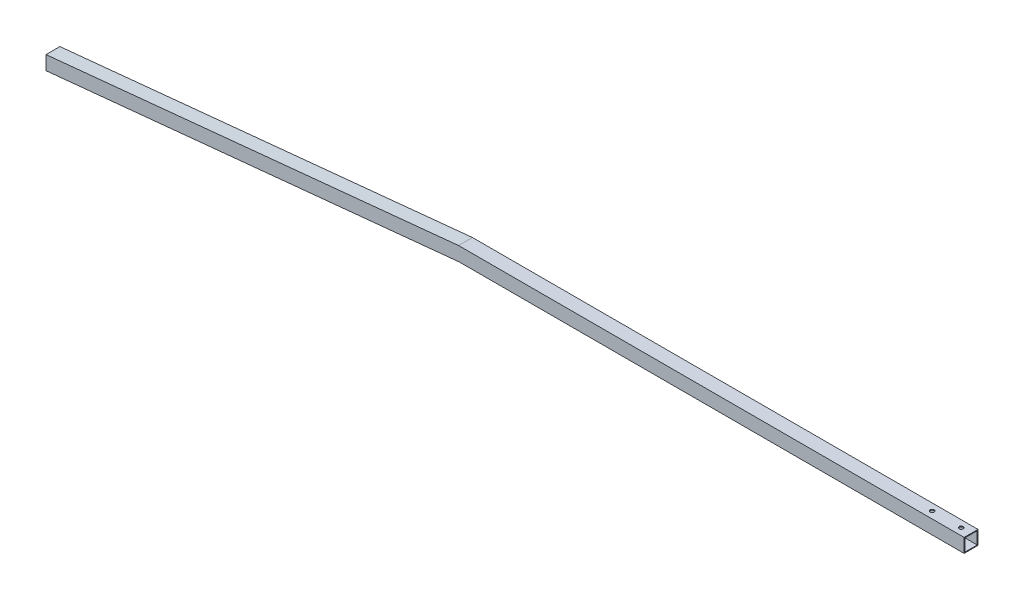
ISO-10303-21;
HEADER;
FILE_DESCRIPTION(('STEP AP214'),'2;1');
FILE_NAME('part.step','',(''),(''),'','','');
FILE_SCHEMA(('AUTOMOTIVE_DESIGN { 1 0 10303 214 1 1 1 1 }'));
ENDSEC;
DATA;
#1=APPLICATION_CONTEXT('core data for automotive mechanical design processes');
#2=APPLICATION_PROTOCOL_DEFINITION('international standard','automotive_design',2000,#1);
#3=PRODUCT_CONTEXT('',#1,'mechanical');
#4=PRODUCT('Part','Part','',(#3));
#5=PRODUCT_RELATED_PRODUCT_CATEGORY('part','',(#4));
#6=PRODUCT_DEFINITION_FORMATION('','',#4);
#7=PRODUCT_DEFINITION_CONTEXT('part definition',#1,'design');
#8=PRODUCT_DEFINITION('design','',#6,#7);
#9=PRODUCT_DEFINITION_SHAPE('','',#8);
#10=(LENGTH_UNIT() NAMED_UNIT(*) SI_UNIT(.MILLI.,.METRE.));
#11=(NAMED_UNIT(*) PLANE_ANGLE_UNIT() SI_UNIT($,.RADIAN.));
#12=(NAMED_UNIT(*) SI_UNIT($,.STERADIAN.) SOLID_ANGLE_UNIT());
#13=UNCERTAINTY_MEASURE_WITH_UNIT(LENGTH_MEASURE(1.E-05),#10,'distance_accuracy_value','');
#14=(GEOMETRIC_REPRESENTATION_CONTEXT(3) GLOBAL_UNCERTAINTY_ASSIGNED_CONTEXT((#13)) GLOBAL_UNIT_ASSIGNED_CONTEXT((#10,
#11,#12)) REPRESENTATION_CONTEXT('',''));
#15=CARTESIAN_POINT('',(0.,0.,0.));
#16=DIRECTION('',(0.,0.,1.));
#17=DIRECTION('',(1.,0.,0.));
#18=AXIS2_PLACEMENT_3D('',#15,#16,#17);
#19=CARTESIAN_POINT('',(848.88,84.1375,-28.575));
#20=DIRECTION('',(0.,-1.,0.));
#21=DIRECTION('',(0.,0.,-1.));
#22=AXIS2_PLACEMENT_3D('',#19,#20,#21);
#23=PLANE('',#22);
#24=CARTESIAN_POINT('',(1809.115,84.1375,-14.2875));
#25=DIRECTION('',(0.,-1.,0.));
#26=DIRECTION('',(-1.,0.,0.));
#27=AXIS2_PLACEMENT_3D('',#24,#25,#26);
#28=CIRCLE('',#27,4.19100000000006);
#29=CARTESIAN_POINT('',(1804.924,84.1375,-14.2875));
#30=VERTEX_POINT('',#29);
#31=EDGE_CURVE('E211',#30,#30,#28,.T.);
#32=ORIENTED_EDGE('',*,*,#31,.T.);
#33=EDGE_LOOP('',(#32));
#34=FACE_BOUND('',#33,.T.);
#35=DIRECTION('',(1.,0.,0.));
#36=VECTOR('',#35,1.);
#37=CARTESIAN_POINT('',(848.88,84.1375,0.));
#38=LINE('',#37,#36);
#39=CARTESIAN_POINT('',(848.88,84.1375,0.));
#40=VERTEX_POINT('',#39);
#41=CARTESIAN_POINT('',(1889.125,84.1375,0.));
#42=VERTEX_POINT('',#41);
#43=EDGE_CURVE('E181',#40,#42,#38,.T.);
#44=ORIENTED_EDGE('',*,*,#43,.T.);
#45=DIRECTION('',(0.,0.,1.));
#46=VECTOR('',#45,1.);
#47=CARTESIAN_POINT('',(1889.125,84.1375,-28.575));
#48=LINE('',#47,#46);
#49=CARTESIAN_POINT('',(1889.125,84.1375,-28.575));
#50=VERTEX_POINT('',#49);
#51=EDGE_CURVE('E204',#50,#42,#48,.T.);
#52=ORIENTED_EDGE('',*,*,#51,.F.);
#53=DIRECTION('',(1.,0.,0.));
#54=VECTOR('',#53,1.);
#55=CARTESIAN_POINT('',(848.88,84.1375,-28.575));
#56=LINE('',#55,#54);
#57=CARTESIAN_POINT('',(848.88,84.1375,-28.575));
#58=VERTEX_POINT('',#57);
#59=EDGE_CURVE('E165',#58,#50,#56,.T.);
#60=ORIENTED_EDGE('',*,*,#59,.F.);
#61=DIRECTION('',(0.,0.,1.));
#62=VECTOR('',#61,1.);
#63=CARTESIAN_POINT('',(848.88,84.1375,-28.575));
#64=LINE('',#63,#62);
#65=EDGE_CURVE('E24',#58,#40,#64,.T.);
#66=ORIENTED_EDGE('',*,*,#65,.T.);
#67=EDGE_LOOP('',(#44,#52,#60,#66));
#68=FACE_BOUND('',#67,.T.);
#69=CARTESIAN_POINT('',(1868.805,84.1375,-14.2875));
#70=DIRECTION('',(0.,-1.,0.));
#71=DIRECTION('',(-1.,0.,0.));
#72=AXIS2_PLACEMENT_3D('',#69,#70,#71);
#73=CIRCLE('',#72,4.19100000000006);
#74=CARTESIAN_POINT('',(1864.614,84.1375,-14.2875));
#75=VERTEX_POINT('',#74);
#76=EDGE_CURVE('E311',#75,#75,#73,.T.);
#77=ORIENTED_EDGE('',*,*,#76,.T.);
#78=EDGE_LOOP('',(#77));
#79=FACE_BOUND('',#78,.T.);
#80=ADVANCED_FACE('F15',(#34,#68,#79),#23,.F.);
#81=CARTESIAN_POINT('',(850.293718292771,55.5625,-28.575));
#82=DIRECTION('',(0.,1.,0.));
#83=DIRECTION('',(-1.,0.,0.));
#84=AXIS2_PLACEMENT_3D('',#81,#82,#83);
#85=PLANE('',#84);
#86=CARTESIAN_POINT('',(1809.115,55.5625,-14.2875));
#87=DIRECTION('',(0.,1.,0.));
#88=DIRECTION('',(-1.,0.,0.));
#89=AXIS2_PLACEMENT_3D('',#86,#87,#88);
#90=CIRCLE('',#89,4.19100000000006);
#91=CARTESIAN_POINT('',(1804.924,55.5625,-14.2875));
#92=VERTEX_POINT('',#91);
#93=EDGE_CURVE('E158',#92,#92,#90,.F.);
#94=ORIENTED_EDGE('',*,*,#93,.F.);
#95=EDGE_LOOP('',(#94));
#96=FACE_BOUND('',#95,.T.);
#97=DIRECTION('',(-1.,0.,0.));
#98=VECTOR('',#97,1.);
#99=CARTESIAN_POINT('',(850.293718292771,55.5625,0.));
#100=LINE('',#99,#98);
#101=CARTESIAN_POINT('',(1889.125,55.5625,0.));
#102=VERTEX_POINT('',#101);
#103=CARTESIAN_POINT('',(850.293718292771,55.5625,0.));
#104=VERTEX_POINT('',#103);
#105=EDGE_CURVE('E187',#102,#104,#100,.T.);
#106=ORIENTED_EDGE('',*,*,#105,.T.);
#107=DIRECTION('',(0.,0.,1.));
#108=VECTOR('',#107,1.);
#109=CARTESIAN_POINT('',(850.293718292771,55.5625,-28.575));
#110=LINE('',#109,#108);
#111=CARTESIAN_POINT('',(850.293718292771,55.5625,-28.575));
#112=VERTEX_POINT('',#111);
#113=EDGE_CURVE('E198',#112,#104,#110,.T.);
#114=ORIENTED_EDGE('',*,*,#113,.F.);
#115=DIRECTION('',(-1.,0.,0.));
#116=VECTOR('',#115,1.);
#117=CARTESIAN_POINT('',(850.293718292771,55.5625,-28.575));
#118=LINE('',#117,#116);
#119=CARTESIAN_POINT('',(1889.125,55.5625,-28.575));
#120=VERTEX_POINT('',#119);
#121=EDGE_CURVE('E170',#120,#112,#118,.T.);
#122=ORIENTED_EDGE('',*,*,#121,.F.);
#123=DIRECTION('',(0.,0.,1.));
#124=VECTOR('',#123,1.);
#125=CARTESIAN_POINT('',(1889.125,55.5625,-28.575));
#126=LINE('',#125,#124);
#127=EDGE_CURVE('E201',#120,#102,#126,.T.);
#128=ORIENTED_EDGE('',*,*,#127,.T.);
#129=EDGE_LOOP('',(#106,#114,#122,#128));
#130=FACE_BOUND('',#129,.T.);
#131=CARTESIAN_POINT('',(1868.805,55.5625,-14.2875));
#132=DIRECTION('',(0.,1.,0.));
#133=DIRECTION('',(-1.,0.,0.));
#134=AXIS2_PLACEMENT_3D('',#131,#132,#133);
#135=CIRCLE('',#134,4.19100000000006);
#136=CARTESIAN_POINT('',(1864.614,55.5625,-14.2875));
#137=VERTEX_POINT('',#136);
#138=EDGE_CURVE('E218',#137,#137,#135,.F.);
#139=ORIENTED_EDGE('',*,*,#138,.F.);
#140=EDGE_LOOP('',(#139));
#141=FACE_BOUND('',#140,.T.);
#142=ADVANCED_FACE('F235',(#96,#130,#141),#85,.F.);
#143=CARTESIAN_POINT('',(848.88,82.5373,-28.575));
#144=DIRECTION('',(0.,-1.,0.));
#145=DIRECTION('',(0.,0.,-1.));
#146=AXIS2_PLACEMENT_3D('',#143,#144,#145);
#147=PLANE('',#146);
#148=CARTESIAN_POINT('',(1809.115,82.5373,-14.2875));
#149=DIRECTION('',(0.,-1.,0.));
#150=DIRECTION('',(0.,0.,-1.));
#151=AXIS2_PLACEMENT_3D('',#148,#149,#150);
#152=CIRCLE('',#151,4.19100000000006);
#153=CARTESIAN_POINT('',(1809.115,82.5373,-18.4785000000001));
#154=VERTEX_POINT('',#153);
#155=EDGE_CURVE('E210',#154,#154,#152,.F.);
#156=ORIENTED_EDGE('',*,*,#155,.T.);
#157=EDGE_LOOP('',(#156));
#158=FACE_BOUND('',#157,.T.);
#159=DIRECTION('',(1.,0.,0.));
#160=VECTOR('',#159,1.);
#161=CARTESIAN_POINT('',(848.88,82.5373,-1.6002));
#162=LINE('',#161,#160);
#163=CARTESIAN_POINT('',(848.959168224395,82.5373,-1.6002));
#164=VERTEX_POINT('',#163);
#165=CARTESIAN_POINT('',(1889.125,82.5373,-1.6002));
#166=VERTEX_POINT('',#165);
#167=EDGE_CURVE('E111',#164,#166,#162,.T.);
#168=ORIENTED_EDGE('',*,*,#167,.F.);
#169=DIRECTION('',(0.,0.,1.));
#170=VECTOR('',#169,1.);
#171=CARTESIAN_POINT('',(848.959168224395,82.5373,-28.575));
#172=LINE('',#171,#170);
#173=CARTESIAN_POINT('',(848.959168224395,82.5373,-26.9748));
#174=VERTEX_POINT('',#173);
#175=EDGE_CURVE('E120',#174,#164,#172,.T.);
#176=ORIENTED_EDGE('',*,*,#175,.F.);
#177=DIRECTION('',(1.,0.,0.));
#178=VECTOR('',#177,1.);
#179=CARTESIAN_POINT('',(848.88,82.5373,-26.9748));
#180=LINE('',#179,#178);
#181=CARTESIAN_POINT('',(1889.125,82.5373,-26.9748));
#182=VERTEX_POINT('',#181);
#183=EDGE_CURVE('E137',#174,#182,#180,.T.);
#184=ORIENTED_EDGE('',*,*,#183,.T.);
#185=DIRECTION('',(0.,0.,1.));
#186=VECTOR('',#185,1.);
#187=CARTESIAN_POINT('',(1889.125,82.5373,-28.575));
#188=LINE('',#187,#186);
#189=EDGE_CURVE('E125',#182,#166,#188,.T.);
#190=ORIENTED_EDGE('',*,*,#189,.T.);
#191=EDGE_LOOP('',(#168,#176,#184,#190));
#192=FACE_BOUND('',#191,.T.);
#193=CARTESIAN_POINT('',(1868.805,82.5373,-14.2875));
#194=DIRECTION('',(0.,-1.,0.));
#195=DIRECTION('',(0.,0.,-1.));
#196=AXIS2_PLACEMENT_3D('',#193,#194,#195);
#197=CIRCLE('',#196,4.19100000000006);
#198=CARTESIAN_POINT('',(1868.805,82.5373,-18.4785000000001));
#199=VERTEX_POINT('',#198);
#200=EDGE_CURVE('E226',#199,#199,#197,.F.);
#201=ORIENTED_EDGE('',*,*,#200,.T.);
#202=EDGE_LOOP('',(#201));
#203=FACE_BOUND('',#202,.T.);
#204=ADVANCED_FACE('F127',(#158,#192,#203),#147,.T.);
#205=CARTESIAN_POINT('',(850.293718292771,57.1627,-28.575));
#206=DIRECTION('',(0.,1.,0.));
#207=DIRECTION('',(-1.,0.,0.));
#208=AXIS2_PLACEMENT_3D('',#205,#206,#207);
#209=PLANE('',#208);
#210=CARTESIAN_POINT('',(1809.115,57.1627,-14.2875));
#211=DIRECTION('',(0.,1.,0.));
#212=DIRECTION('',(-1.,0.,0.));
#213=AXIS2_PLACEMENT_3D('',#210,#211,#212);
#214=CIRCLE('',#213,4.19100000000006);
#215=CARTESIAN_POINT('',(1804.924,57.1627,-14.2875));
#216=VERTEX_POINT('',#215);
#217=EDGE_CURVE('E208',#216,#216,#214,.F.);
#218=ORIENTED_EDGE('',*,*,#217,.T.);
#219=EDGE_LOOP('',(#218));
#220=FACE_BOUND('',#219,.T.);
#221=DIRECTION('',(-1.,0.,0.));
#222=VECTOR('',#221,1.);
#223=CARTESIAN_POINT('',(850.293718292771,57.1627,-1.6002));
#224=LINE('',#223,#222);
#225=CARTESIAN_POINT('',(1889.125,57.1627,-1.6002));
#226=VERTEX_POINT('',#225);
#227=CARTESIAN_POINT('',(850.214550068379,57.1627,-1.6002));
#228=VERTEX_POINT('',#227);
#229=EDGE_CURVE('E133',#226,#228,#224,.T.);
#230=ORIENTED_EDGE('',*,*,#229,.F.);
#231=DIRECTION('',(0.,0.,1.));
#232=VECTOR('',#231,1.);
#233=CARTESIAN_POINT('',(1889.125,57.1627,-28.575));
#234=LINE('',#233,#232);
#235=CARTESIAN_POINT('',(1889.125,57.1627,-26.9748));
#236=VERTEX_POINT('',#235);
#237=EDGE_CURVE('E150',#236,#226,#234,.T.);
#238=ORIENTED_EDGE('',*,*,#237,.F.);
#239=DIRECTION('',(-1.,0.,0.));
#240=VECTOR('',#239,1.);
#241=CARTESIAN_POINT('',(850.293718292771,57.1627,-26.9748));
#242=LINE('',#241,#240);
#243=CARTESIAN_POINT('',(850.214550068379,57.1627,-26.9748));
#244=VERTEX_POINT('',#243);
#245=EDGE_CURVE('E139',#236,#244,#242,.T.);
#246=ORIENTED_EDGE('',*,*,#245,.T.);
#247=DIRECTION('',(0.,0.,1.));
#248=VECTOR('',#247,1.);
#249=CARTESIAN_POINT('',(850.21455006838,57.1627,-28.575));
#250=LINE('',#249,#248);
#251=EDGE_CURVE('E147',#244,#228,#250,.T.);
#252=ORIENTED_EDGE('',*,*,#251,.T.);
#253=EDGE_LOOP('',(#230,#238,#246,#252));
#254=FACE_BOUND('',#253,.T.);
#255=CARTESIAN_POINT('',(1868.805,57.1627,-14.2875));
#256=DIRECTION('',(0.,1.,0.));
#257=DIRECTION('',(-1.,0.,0.));
#258=AXIS2_PLACEMENT_3D('',#255,#256,#257);
#259=CIRCLE('',#258,4.19100000000006);
#260=CARTESIAN_POINT('',(1864.614,57.1627,-14.2875));
#261=VERTEX_POINT('',#260);
#262=EDGE_CURVE('E19',#261,#261,#259,.F.);
#263=ORIENTED_EDGE('',*,*,#262,.T.);
#264=EDGE_LOOP('',(#263));
#265=FACE_BOUND('',#264,.T.);
#266=ADVANCED_FACE('F299',(#220,#254,#265),#209,.T.);
#267=CARTESIAN_POINT('',(0.,-0.063500000000008,-28.575));
#268=DIRECTION('',(1.,0.,0.));
#269=DIRECTION('',(0.,1.,0.));
#270=AXIS2_PLACEMENT_3D('',#267,#268,#269);
#271=PLANE('',#270);
#272=DIRECTION('',(0.,1.,0.));
#273=VECTOR('',#272,1.);
#274=CARTESIAN_POINT('',(0.,-0.063500000000008,0.));
#275=LINE('',#274,#273);
#276=CARTESIAN_POINT('',(0.,-28.7787277047046,0.));
#277=VERTEX_POINT('',#276);
#278=CARTESIAN_POINT('',(0.,-0.063500000000008,0.));
#279=VERTEX_POINT('',#278);
#280=EDGE_CURVE('E153',#277,#279,#275,.T.);
#281=ORIENTED_EDGE('',*,*,#280,.T.);
#282=DIRECTION('',(0.,0.,1.));
#283=VECTOR('',#282,1.);
#284=CARTESIAN_POINT('',(0.,-0.063500000000008,-28.575));
#285=LINE('',#284,#283);
#286=CARTESIAN_POINT('',(0.,-0.063500000000008,-28.575));
#287=VERTEX_POINT('',#286);
#288=EDGE_CURVE('E9',#287,#279,#285,.T.);
#289=ORIENTED_EDGE('',*,*,#288,.F.);
#290=DIRECTION('',(0.,1.,0.));
#291=VECTOR('',#290,1.);
#292=CARTESIAN_POINT('',(0.,-0.063500000000008,-28.575));
#293=LINE('',#292,#291);
#294=CARTESIAN_POINT('',(0.,-28.7787277047046,-28.575));
#295=VERTEX_POINT('',#294);
#296=EDGE_CURVE('E166',#295,#287,#293,.T.);
#297=ORIENTED_EDGE('',*,*,#296,.F.);
#298=DIRECTION('',(0.,0.,1.));
#299=VECTOR('',#298,1.);
#300=CARTESIAN_POINT('',(0.,-28.7787277047046,-28.575));
#301=LINE('',#300,#299);
#302=EDGE_CURVE('E174',#295,#277,#301,.T.);
#303=ORIENTED_EDGE('',*,*,#302,.T.);
#304=EDGE_LOOP('',(#281,#289,#297,#303));
#305=FACE_BOUND('',#304,.T.);
#306=DIRECTION('',(0.,1.,0.));
#307=VECTOR('',#306,1.);
#308=CARTESIAN_POINT('',(0.,-0.063500000000008,-1.6002));
#309=LINE('',#308,#307);
#310=CARTESIAN_POINT('',(0.,-27.1706749532411,-1.6002));
#311=VERTEX_POINT('',#310);
#312=CARTESIAN_POINT('',(0.,-1.67155275146346,-1.6002));
#313=VERTEX_POINT('',#312);
#314=EDGE_CURVE('E114',#311,#313,#309,.T.);
#315=ORIENTED_EDGE('',*,*,#314,.F.);
#316=DIRECTION('',(0.,0.,1.));
#317=VECTOR('',#316,1.);
#318=CARTESIAN_POINT('',(0.,-27.1706749532411,-28.575));
#319=LINE('',#318,#317);
#320=CARTESIAN_POINT('',(0.,-27.1706749532411,-26.9748));
#321=VERTEX_POINT('',#320);
#322=EDGE_CURVE('E143',#321,#311,#319,.T.);
#323=ORIENTED_EDGE('',*,*,#322,.F.);
#324=DIRECTION('',(0.,1.,0.));
#325=VECTOR('',#324,1.);
#326=CARTESIAN_POINT('',(0.,-0.063500000000008,-26.9748));
#327=LINE('',#326,#325);
#328=CARTESIAN_POINT('',(0.,-1.67155275146346,-26.9748));
#329=VERTEX_POINT('',#328);
#330=EDGE_CURVE('E32',#321,#329,#327,.T.);
#331=ORIENTED_EDGE('',*,*,#330,.T.);
#332=DIRECTION('',(0.,0.,1.));
#333=VECTOR('',#332,1.);
#334=CARTESIAN_POINT('',(0.,-1.67155275146346,-28.575));
#335=LINE('',#334,#333);
#336=EDGE_CURVE('E124',#329,#313,#335,.T.);
#337=ORIENTED_EDGE('',*,*,#336,.T.);
#338=EDGE_LOOP('',(#315,#323,#331,#337));
#339=FACE_BOUND('',#338,.T.);
#340=ADVANCED_FACE('F17',(#305,#339),#271,.F.);
#341=CARTESIAN_POINT('',(1889.125,84.1375,-28.575));
#342=DIRECTION('',(-1.,0.,0.));
#343=DIRECTION('',(0.,0.,1.));
#344=AXIS2_PLACEMENT_3D('',#341,#342,#343);
#345=PLANE('',#344);
#346=DIRECTION('',(0.,-1.,0.));
#347=VECTOR('',#346,1.);
#348=CARTESIAN_POINT('',(1889.125,84.1375,0.));
#349=LINE('',#348,#347);
#350=EDGE_CURVE('E184',#42,#102,#349,.T.);
#351=ORIENTED_EDGE('',*,*,#350,.T.);
#352=ORIENTED_EDGE('',*,*,#127,.F.);
#353=DIRECTION('',(0.,-1.,0.));
#354=VECTOR('',#353,1.);
#355=CARTESIAN_POINT('',(1889.125,84.1375,-28.575));
#356=LINE('',#355,#354);
#357=EDGE_CURVE('E168',#50,#120,#356,.T.);
#358=ORIENTED_EDGE('',*,*,#357,.F.);
#359=ORIENTED_EDGE('',*,*,#51,.T.);
#360=EDGE_LOOP('',(#351,#352,#358,#359));
#361=FACE_BOUND('',#360,.T.);
#362=DIRECTION('',(0.,-1.,0.));
#363=VECTOR('',#362,1.);
#364=CARTESIAN_POINT('',(1889.125,84.1375,-1.6002));
#365=LINE('',#364,#363);
#366=EDGE_CURVE('E131',#166,#226,#365,.T.);
#367=ORIENTED_EDGE('',*,*,#366,.F.);
#368=ORIENTED_EDGE('',*,*,#189,.F.);
#369=DIRECTION('',(0.,-1.,0.));
#370=VECTOR('',#369,1.);
#371=CARTESIAN_POINT('',(1889.125,84.1375,-26.9748));
#372=LINE('',#371,#370);
#373=EDGE_CURVE('E39',#182,#236,#372,.T.);
#374=ORIENTED_EDGE('',*,*,#373,.T.);
#375=ORIENTED_EDGE('',*,*,#237,.T.);
#376=EDGE_LOOP('',(#367,#368,#374,#375));
#377=FACE_BOUND('',#376,.T.);
#378=ADVANCED_FACE('F265',(#361,#377),#345,.F.);
#379=CARTESIAN_POINT('',(0.,-0.063500000000008,-28.575));
#380=DIRECTION('',(0.0987063112987342,-0.995116608297639,0.));
#381=DIRECTION('',(0.995116608297639,0.0987063112987342,0.));
#382=AXIS2_PLACEMENT_3D('',#379,#380,#381);
#383=PLANE('',#382);
#384=DIRECTION('',(0.995116608297639,0.0987063112987342,0.));
#385=VECTOR('',#384,1.);
#386=CARTESIAN_POINT('',(0.,-0.063500000000008,0.));
#387=LINE('',#386,#385);
#388=EDGE_CURVE('E178',#279,#40,#387,.T.);
#389=ORIENTED_EDGE('',*,*,#388,.T.);
#390=ORIENTED_EDGE('',*,*,#65,.F.);
#391=DIRECTION('',(0.995116608297639,0.0987063112987342,0.));
#392=VECTOR('',#391,1.);
#393=CARTESIAN_POINT('',(0.,-0.063500000000008,-28.575));
#394=LINE('',#393,#392);
#395=EDGE_CURVE('E163',#287,#58,#394,.T.);
#396=ORIENTED_EDGE('',*,*,#395,.F.);
#397=ORIENTED_EDGE('',*,*,#288,.T.);
#398=EDGE_LOOP('',(#389,#390,#396,#397));
#399=FACE_BOUND('',#398,.T.);
#400=ADVANCED_FACE('F266',(#399),#383,.F.);
#401=CARTESIAN_POINT('',(2.82053284536134,-28.4989570821051,-28.575));
#402=DIRECTION('',(-0.0987063112987338,0.995116608297639,0.));
#403=DIRECTION('',(-0.995116608297639,-0.0987063112987338,0.));
#404=AXIS2_PLACEMENT_3D('',#401,#402,#403);
#405=PLANE('',#404);
#406=DIRECTION('',(-0.995116608297639,-0.0987063112987338,0.));
#407=VECTOR('',#406,1.);
#408=CARTESIAN_POINT('',(2.82053284536134,-28.4989570821051,0.));
#409=LINE('',#408,#407);
#410=EDGE_CURVE('E177',#104,#277,#409,.T.);
#411=ORIENTED_EDGE('',*,*,#410,.T.);
#412=ORIENTED_EDGE('',*,*,#302,.F.);
#413=DIRECTION('',(-0.995116608297639,-0.0987063112987342,0.));
#414=VECTOR('',#413,1.);
#415=CARTESIAN_POINT('',(65.7909303247936,-22.2528793818816,-28.575));
#416=LINE('',#415,#414);
#417=EDGE_CURVE('E172',#112,#295,#416,.T.);
#418=ORIENTED_EDGE('',*,*,#417,.F.);
#419=ORIENTED_EDGE('',*,*,#113,.T.);
#420=EDGE_LOOP('',(#411,#412,#418,#419));
#421=FACE_BOUND('',#420,.T.);
#422=ADVANCED_FACE('F268',(#421),#405,.F.);
#423=CARTESIAN_POINT('',(0.,0.,-28.575));
#424=DIRECTION('',(0.,0.,-1.));
#425=DIRECTION('',(-1.,0.,0.));
#426=AXIS2_PLACEMENT_3D('',#423,#424,#425);
#427=PLANE('',#426);
#428=ORIENTED_EDGE('',*,*,#296,.T.);
#429=ORIENTED_EDGE('',*,*,#395,.T.);
#430=ORIENTED_EDGE('',*,*,#59,.T.);
#431=ORIENTED_EDGE('',*,*,#357,.T.);
#432=ORIENTED_EDGE('',*,*,#121,.T.);
#433=ORIENTED_EDGE('',*,*,#417,.T.);
#434=EDGE_LOOP('',(#428,#429,#430,#431,#432,#433));
#435=FACE_BOUND('',#434,.T.);
#436=ADVANCED_FACE('F274',(#435),#427,.T.);
#437=CARTESIAN_POINT('',(0.,0.,0.));
#438=DIRECTION('',(0.,0.,-1.));
#439=DIRECTION('',(-1.,0.,0.));
#440=AXIS2_PLACEMENT_3D('',#437,#438,#439);
#441=PLANE('',#440);
#442=ORIENTED_EDGE('',*,*,#280,.F.);
#443=ORIENTED_EDGE('',*,*,#410,.F.);
#444=ORIENTED_EDGE('',*,*,#105,.F.);
#445=ORIENTED_EDGE('',*,*,#350,.F.);
#446=ORIENTED_EDGE('',*,*,#43,.F.);
#447=ORIENTED_EDGE('',*,*,#388,.F.);
#448=EDGE_LOOP('',(#442,#443,#444,#445,#446,#447));
#449=FACE_BOUND('',#448,.T.);
#450=ADVANCED_FACE('F287',(#449),#441,.F.);
#451=CARTESIAN_POINT('',(0.157949839340245,-1.65588559659789,-28.575));
#452=DIRECTION('',(0.0987063112987342,-0.995116608297639,0.));
#453=DIRECTION('',(0.995116608297639,0.0987063112987342,0.));
#454=AXIS2_PLACEMENT_3D('',#451,#452,#453);
#455=PLANE('',#454);
#456=DIRECTION('',(0.995116608297639,0.0987063112987342,0.));
#457=VECTOR('',#456,1.);
#458=CARTESIAN_POINT('',(0.157949839340245,-1.65588559659789,-1.6002));
#459=LINE('',#458,#457);
#460=EDGE_CURVE('E107',#313,#164,#459,.T.);
#461=ORIENTED_EDGE('',*,*,#460,.F.);
#462=ORIENTED_EDGE('',*,*,#336,.F.);
#463=DIRECTION('',(0.995116608297639,0.0987063112987342,0.));
#464=VECTOR('',#463,1.);
#465=CARTESIAN_POINT('',(0.157949839340245,-1.65588559659789,-26.9748));
#466=LINE('',#465,#464);
#467=EDGE_CURVE('E122',#329,#174,#466,.T.);
#468=ORIENTED_EDGE('',*,*,#467,.T.);
#469=ORIENTED_EDGE('',*,*,#175,.T.);
#470=EDGE_LOOP('',(#461,#462,#468,#469));
#471=FACE_BOUND('',#470,.T.);
#472=ADVANCED_FACE('F121',(#471),#455,.T.);
#473=CARTESIAN_POINT('',(2.66258300602111,-26.9065714855072,-28.575));
#474=DIRECTION('',(-0.0987063112987338,0.995116608297639,0.));
#475=DIRECTION('',(-0.995116608297639,-0.0987063112987338,0.));
#476=AXIS2_PLACEMENT_3D('',#473,#474,#475);
#477=PLANE('',#476);
#478=DIRECTION('',(-0.995116608297639,-0.0987063112987338,0.));
#479=VECTOR('',#478,1.);
#480=CARTESIAN_POINT('',(2.66258300602111,-26.9065714855072,-1.6002));
#481=LINE('',#480,#479);
#482=EDGE_CURVE('E146',#228,#311,#481,.T.);
#483=ORIENTED_EDGE('',*,*,#482,.F.);
#484=ORIENTED_EDGE('',*,*,#251,.F.);
#485=DIRECTION('',(-0.995116608297639,-0.0987063112987338,0.));
#486=VECTOR('',#485,1.);
#487=CARTESIAN_POINT('',(2.66258300602111,-26.9065714855072,-26.9748));
#488=LINE('',#487,#486);
#489=EDGE_CURVE('E141',#244,#321,#488,.T.);
#490=ORIENTED_EDGE('',*,*,#489,.T.);
#491=ORIENTED_EDGE('',*,*,#322,.T.);
#492=EDGE_LOOP('',(#483,#484,#490,#491));
#493=FACE_BOUND('',#492,.T.);
#494=ADVANCED_FACE('F302',(#493),#477,.T.);
#495=CARTESIAN_POINT('',(0.,0.,-26.9748));
#496=DIRECTION('',(0.,0.,-1.));
#497=DIRECTION('',(-1.,0.,0.));
#498=AXIS2_PLACEMENT_3D('',#495,#496,#497);
#499=PLANE('',#498);
#500=ORIENTED_EDGE('',*,*,#330,.F.);
#501=ORIENTED_EDGE('',*,*,#489,.F.);
#502=ORIENTED_EDGE('',*,*,#245,.F.);
#503=ORIENTED_EDGE('',*,*,#373,.F.);
#504=ORIENTED_EDGE('',*,*,#183,.F.);
#505=ORIENTED_EDGE('',*,*,#467,.F.);
#506=EDGE_LOOP('',(#500,#501,#502,#503,#504,#505));
#507=FACE_BOUND('',#506,.T.);
#508=ADVANCED_FACE('F304',(#507),#499,.F.);
#509=CARTESIAN_POINT('',(0.,0.,-1.6002));
#510=DIRECTION('',(0.,0.,-1.));
#511=DIRECTION('',(-1.,0.,0.));
#512=AXIS2_PLACEMENT_3D('',#509,#510,#511);
#513=PLANE('',#512);
#514=ORIENTED_EDGE('',*,*,#314,.T.);
#515=ORIENTED_EDGE('',*,*,#460,.T.);
#516=ORIENTED_EDGE('',*,*,#167,.T.);
#517=ORIENTED_EDGE('',*,*,#366,.T.);
#518=ORIENTED_EDGE('',*,*,#229,.T.);
#519=ORIENTED_EDGE('',*,*,#482,.T.);
#520=EDGE_LOOP('',(#514,#515,#516,#517,#518,#519));
#521=FACE_BOUND('',#520,.T.);
#522=ADVANCED_FACE('F109',(#521),#513,.T.);
#523=CARTESIAN_POINT('',(1809.115,39.6889765919313,-14.2875));
#524=DIRECTION('',(0.,1.,0.));
#525=DIRECTION('',(0.,0.,1.));
#526=AXIS2_PLACEMENT_3D('',#523,#524,#525);
#527=CYLINDRICAL_SURFACE('',#526,4.19100000000006);
#528=ORIENTED_EDGE('',*,*,#217,.F.);
#529=EDGE_LOOP('',(#528));
#530=FACE_BOUND('',#529,.T.);
#531=ORIENTED_EDGE('',*,*,#93,.T.);
#532=EDGE_LOOP('',(#531));
#533=FACE_BOUND('',#532,.T.);
#534=ADVANCED_FACE('F233',(#530,#533),#527,.F.);
#535=ORIENTED_EDGE('',*,*,#155,.F.);
#536=EDGE_LOOP('',(#535));
#537=FACE_BOUND('',#536,.T.);
#538=ORIENTED_EDGE('',*,*,#31,.F.);
#539=EDGE_LOOP('',(#538));
#540=FACE_BOUND('',#539,.T.);
#541=ADVANCED_FACE('F247',(#537,#540),#527,.F.);
#542=CARTESIAN_POINT('',(1868.805,39.6889765919313,-14.2875));
#543=DIRECTION('',(0.,1.,0.));
#544=DIRECTION('',(0.,0.,1.));
#545=AXIS2_PLACEMENT_3D('',#542,#543,#544);
#546=CYLINDRICAL_SURFACE('',#545,4.19100000000006);
#547=ORIENTED_EDGE('',*,*,#262,.F.);
#548=EDGE_LOOP('',(#547));
#549=FACE_BOUND('',#548,.T.);
#550=ORIENTED_EDGE('',*,*,#138,.T.);
#551=EDGE_LOOP('',(#550));
#552=FACE_BOUND('',#551,.T.);
#553=ADVANCED_FACE('F244',(#549,#552),#546,.F.);
#554=ORIENTED_EDGE('',*,*,#200,.F.);
#555=EDGE_LOOP('',(#554));
#556=FACE_BOUND('',#555,.T.);
#557=ORIENTED_EDGE('',*,*,#76,.F.);
#558=EDGE_LOOP('',(#557));
#559=FACE_BOUND('',#558,.T.);
#560=ADVANCED_FACE('F246',(#556,#559),#546,.F.);
#561=CLOSED_SHELL('',(#80,#142,#204,#266,#340,#378,#400,#422,#436,#450,#472,#494,#508,#522,#534,
#541,#553,#560));
#562=MANIFOLD_SOLID_BREP('B1',#561);
#563=ADVANCED_BREP_SHAPE_REPRESENTATION('',(#18,#562),#14);
#564=SHAPE_DEFINITION_REPRESENTATION(#9,#563);
ENDSEC;
END-ISO-10303-21;
